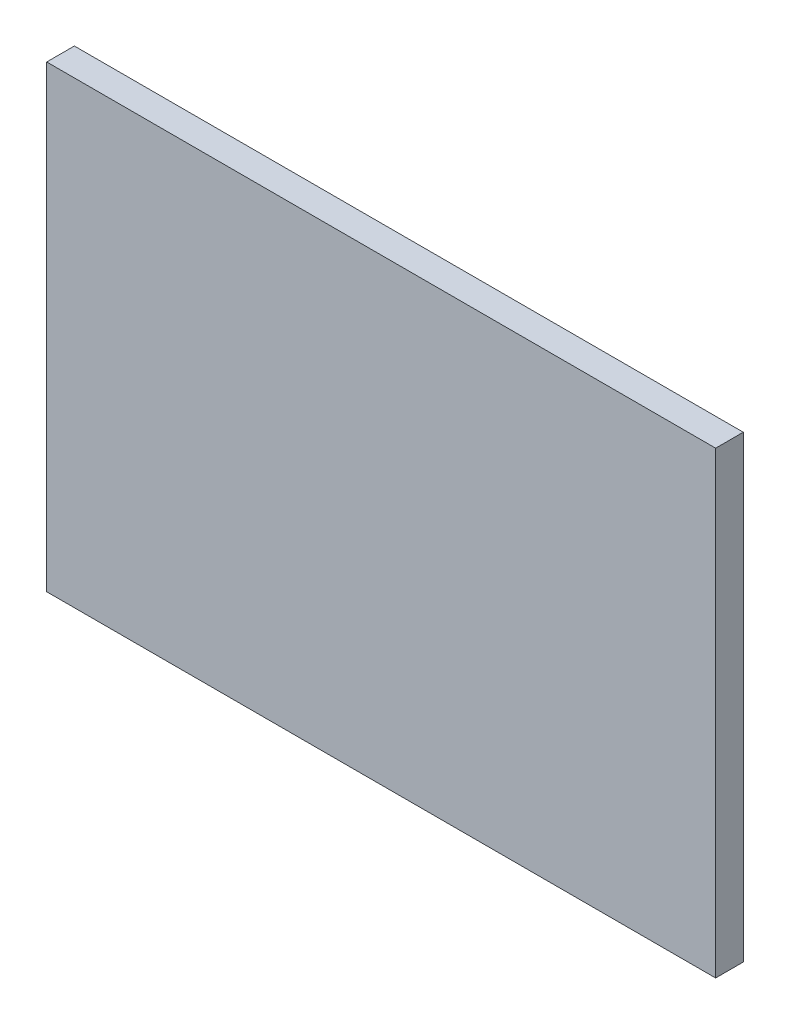
ISO-10303-21;
HEADER;
FILE_DESCRIPTION(('STEP AP214'),'2;1');
FILE_NAME('part.step','',(''),(''),'','','');
FILE_SCHEMA(('AUTOMOTIVE_DESIGN { 1 0 10303 214 1 1 1 1 }'));
ENDSEC;
DATA;
#1=APPLICATION_CONTEXT('core data for automotive mechanical design processes');
#2=APPLICATION_PROTOCOL_DEFINITION('international standard','automotive_design',2000,#1);
#3=PRODUCT_CONTEXT('',#1,'mechanical');
#4=PRODUCT('Part','Part','',(#3));
#5=PRODUCT_RELATED_PRODUCT_CATEGORY('part','',(#4));
#6=PRODUCT_DEFINITION_FORMATION('','',#4);
#7=PRODUCT_DEFINITION_CONTEXT('part definition',#1,'design');
#8=PRODUCT_DEFINITION('design','',#6,#7);
#9=PRODUCT_DEFINITION_SHAPE('','',#8);
#10=(LENGTH_UNIT() NAMED_UNIT(*) SI_UNIT(.MILLI.,.METRE.));
#11=(NAMED_UNIT(*) PLANE_ANGLE_UNIT() SI_UNIT($,.RADIAN.));
#12=(NAMED_UNIT(*) SI_UNIT($,.STERADIAN.) SOLID_ANGLE_UNIT());
#13=UNCERTAINTY_MEASURE_WITH_UNIT(LENGTH_MEASURE(1.E-05),#10,'distance_accuracy_value','');
#14=(GEOMETRIC_REPRESENTATION_CONTEXT(3) GLOBAL_UNCERTAINTY_ASSIGNED_CONTEXT((#13)) GLOBAL_UNIT_ASSIGNED_CONTEXT((#10,
#11,#12)) REPRESENTATION_CONTEXT('',''));
#15=CARTESIAN_POINT('',(0.,0.,0.));
#16=DIRECTION('',(0.,0.,1.));
#17=DIRECTION('',(1.,0.,0.));
#18=AXIS2_PLACEMENT_3D('',#15,#16,#17);
#19=CARTESIAN_POINT('',(-45.7984644913628,34.4337811900192,5.));
#20=DIRECTION('',(1.,0.,0.));
#21=DIRECTION('',(0.,1.,0.));
#22=AXIS2_PLACEMENT_3D('',#19,#20,#21);
#23=PLANE('',#22);
#24=DIRECTION('',(0.,-1.,0.));
#25=VECTOR('',#24,1.);
#26=CARTESIAN_POINT('',(-45.7984644913628,34.4337811900192,0.));
#27=LINE('',#26,#25);
#28=CARTESIAN_POINT('',(-45.7984644913628,34.4337811900192,0.));
#29=VERTEX_POINT('',#28);
#30=CARTESIAN_POINT('',(-45.7984644913628,-48.5662188099808,0.));
#31=VERTEX_POINT('',#30);
#32=EDGE_CURVE('E111',#29,#31,#27,.T.);
#33=ORIENTED_EDGE('',*,*,#32,.T.);
#34=DIRECTION('',(0.,0.,-1.));
#35=VECTOR('',#34,1.);
#36=CARTESIAN_POINT('',(-45.7984644913628,-48.5662188099808,5.));
#37=LINE('',#36,#35);
#38=CARTESIAN_POINT('',(-45.7984644913628,-48.5662188099808,5.));
#39=VERTEX_POINT('',#38);
#40=EDGE_CURVE('E11',#39,#31,#37,.T.);
#41=ORIENTED_EDGE('',*,*,#40,.F.);
#42=DIRECTION('',(0.,-1.,0.));
#43=VECTOR('',#42,1.);
#44=CARTESIAN_POINT('',(-45.7984644913628,34.4337811900192,5.));
#45=LINE('',#44,#43);
#46=CARTESIAN_POINT('',(-45.7984644913628,34.4337811900192,5.));
#47=VERTEX_POINT('',#46);
#48=EDGE_CURVE('E95',#47,#39,#45,.T.);
#49=ORIENTED_EDGE('',*,*,#48,.F.);
#50=DIRECTION('',(0.,0.,-1.));
#51=VECTOR('',#50,1.);
#52=CARTESIAN_POINT('',(-45.7984644913628,34.4337811900192,5.));
#53=LINE('',#52,#51);
#54=EDGE_CURVE('E107',#47,#29,#53,.T.);
#55=ORIENTED_EDGE('',*,*,#54,.T.);
#56=EDGE_LOOP('',(#33,#41,#49,#55));
#57=FACE_BOUND('',#56,.T.);
#58=ADVANCED_FACE('F43',(#57),#23,.F.);
#59=CARTESIAN_POINT('',(-45.7984644913628,-48.5662188099808,5.));
#60=DIRECTION('',(0.,1.,0.));
#61=DIRECTION('',(0.,0.,1.));
#62=AXIS2_PLACEMENT_3D('',#59,#60,#61);
#63=PLANE('',#62);
#64=DIRECTION('',(1.,0.,0.));
#65=VECTOR('',#64,1.);
#66=CARTESIAN_POINT('',(-45.7984644913628,-48.5662188099808,0.));
#67=LINE('',#66,#65);
#68=CARTESIAN_POINT('',(75.2015355086372,-48.5662188099808,0.));
#69=VERTEX_POINT('',#68);
#70=EDGE_CURVE('E100',#31,#69,#67,.T.);
#71=ORIENTED_EDGE('',*,*,#70,.T.);
#72=DIRECTION('',(0.,0.,-1.));
#73=VECTOR('',#72,1.);
#74=CARTESIAN_POINT('',(75.2015355086372,-48.5662188099808,5.));
#75=LINE('',#74,#73);
#76=CARTESIAN_POINT('',(75.2015355086372,-48.5662188099808,5.));
#77=VERTEX_POINT('',#76);
#78=EDGE_CURVE('E52',#77,#69,#75,.T.);
#79=ORIENTED_EDGE('',*,*,#78,.F.);
#80=DIRECTION('',(1.,0.,0.));
#81=VECTOR('',#80,1.);
#82=CARTESIAN_POINT('',(-45.7984644913628,-48.5662188099808,5.));
#83=LINE('',#82,#81);
#84=EDGE_CURVE('E90',#39,#77,#83,.T.);
#85=ORIENTED_EDGE('',*,*,#84,.F.);
#86=ORIENTED_EDGE('',*,*,#40,.T.);
#87=EDGE_LOOP('',(#71,#79,#85,#86));
#88=FACE_BOUND('',#87,.T.);
#89=ADVANCED_FACE('F99',(#88),#63,.F.);
#90=CARTESIAN_POINT('',(75.2015355086372,34.4337811900192,5.));
#91=DIRECTION('',(-1.,0.,0.));
#92=DIRECTION('',(0.,0.,1.));
#93=AXIS2_PLACEMENT_3D('',#90,#91,#92);
#94=PLANE('',#93);
#95=DIRECTION('',(0.,1.,0.));
#96=VECTOR('',#95,1.);
#97=CARTESIAN_POINT('',(75.2015355086372,34.4337811900192,0.));
#98=LINE('',#97,#96);
#99=CARTESIAN_POINT('',(75.2015355086372,34.4337811900192,0.));
#100=VERTEX_POINT('',#99);
#101=EDGE_CURVE('E77',#69,#100,#98,.T.);
#102=ORIENTED_EDGE('',*,*,#101,.T.);
#103=DIRECTION('',(0.,0.,-1.));
#104=VECTOR('',#103,1.);
#105=CARTESIAN_POINT('',(75.2015355086372,34.4337811900192,5.));
#106=LINE('',#105,#104);
#107=CARTESIAN_POINT('',(75.2015355086372,34.4337811900192,5.));
#108=VERTEX_POINT('',#107);
#109=EDGE_CURVE('E102',#108,#100,#106,.T.);
#110=ORIENTED_EDGE('',*,*,#109,.F.);
#111=DIRECTION('',(0.,1.,0.));
#112=VECTOR('',#111,1.);
#113=CARTESIAN_POINT('',(75.2015355086372,34.4337811900192,5.));
#114=LINE('',#113,#112);
#115=EDGE_CURVE('E93',#77,#108,#114,.T.);
#116=ORIENTED_EDGE('',*,*,#115,.F.);
#117=ORIENTED_EDGE('',*,*,#78,.T.);
#118=EDGE_LOOP('',(#102,#110,#116,#117));
#119=FACE_BOUND('',#118,.T.);
#120=ADVANCED_FACE('F103',(#119),#94,.F.);
#121=CARTESIAN_POINT('',(-45.7984644913628,34.4337811900192,5.));
#122=DIRECTION('',(0.,-1.,0.));
#123=DIRECTION('',(0.,0.,-1.));
#124=AXIS2_PLACEMENT_3D('',#121,#122,#123);
#125=PLANE('',#124);
#126=DIRECTION('',(-1.,0.,0.));
#127=VECTOR('',#126,1.);
#128=CARTESIAN_POINT('',(-45.7984644913628,34.4337811900192,0.));
#129=LINE('',#128,#127);
#130=EDGE_CURVE('E83',#100,#29,#129,.T.);
#131=ORIENTED_EDGE('',*,*,#130,.T.);
#132=ORIENTED_EDGE('',*,*,#54,.F.);
#133=DIRECTION('',(-1.,0.,0.));
#134=VECTOR('',#133,1.);
#135=CARTESIAN_POINT('',(-45.7984644913628,34.4337811900192,5.));
#136=LINE('',#135,#134);
#137=EDGE_CURVE('E60',#108,#47,#136,.T.);
#138=ORIENTED_EDGE('',*,*,#137,.F.);
#139=ORIENTED_EDGE('',*,*,#109,.T.);
#140=EDGE_LOOP('',(#131,#132,#138,#139));
#141=FACE_BOUND('',#140,.T.);
#142=ADVANCED_FACE('F124',(#141),#125,.F.);
#143=CARTESIAN_POINT('',(0.,0.,5.));
#144=DIRECTION('',(0.,0.,1.));
#145=DIRECTION('',(1.,0.,0.));
#146=AXIS2_PLACEMENT_3D('',#143,#144,#145);
#147=PLANE('',#146);
#148=ORIENTED_EDGE('',*,*,#48,.T.);
#149=ORIENTED_EDGE('',*,*,#84,.T.);
#150=ORIENTED_EDGE('',*,*,#115,.T.);
#151=ORIENTED_EDGE('',*,*,#137,.T.);
#152=EDGE_LOOP('',(#148,#149,#150,#151));
#153=FACE_BOUND('',#152,.T.);
#154=ADVANCED_FACE('F91',(#153),#147,.T.);
#155=CARTESIAN_POINT('',(0.,0.,0.));
#156=DIRECTION('',(0.,0.,1.));
#157=DIRECTION('',(1.,0.,0.));
#158=AXIS2_PLACEMENT_3D('',#155,#156,#157);
#159=PLANE('',#158);
#160=ORIENTED_EDGE('',*,*,#32,.F.);
#161=ORIENTED_EDGE('',*,*,#130,.F.);
#162=ORIENTED_EDGE('',*,*,#101,.F.);
#163=ORIENTED_EDGE('',*,*,#70,.F.);
#164=EDGE_LOOP('',(#160,#161,#162,#163));
#165=FACE_BOUND('',#164,.T.);
#166=ADVANCED_FACE('F127',(#165),#159,.F.);
#167=CLOSED_SHELL('',(#58,#89,#120,#142,#154,#166));
#168=MANIFOLD_SOLID_BREP('B2',#167);
#169=ADVANCED_BREP_SHAPE_REPRESENTATION('',(#18,#168),#14);
#170=SHAPE_DEFINITION_REPRESENTATION(#9,#169);
ENDSEC;
END-ISO-10303-21;
